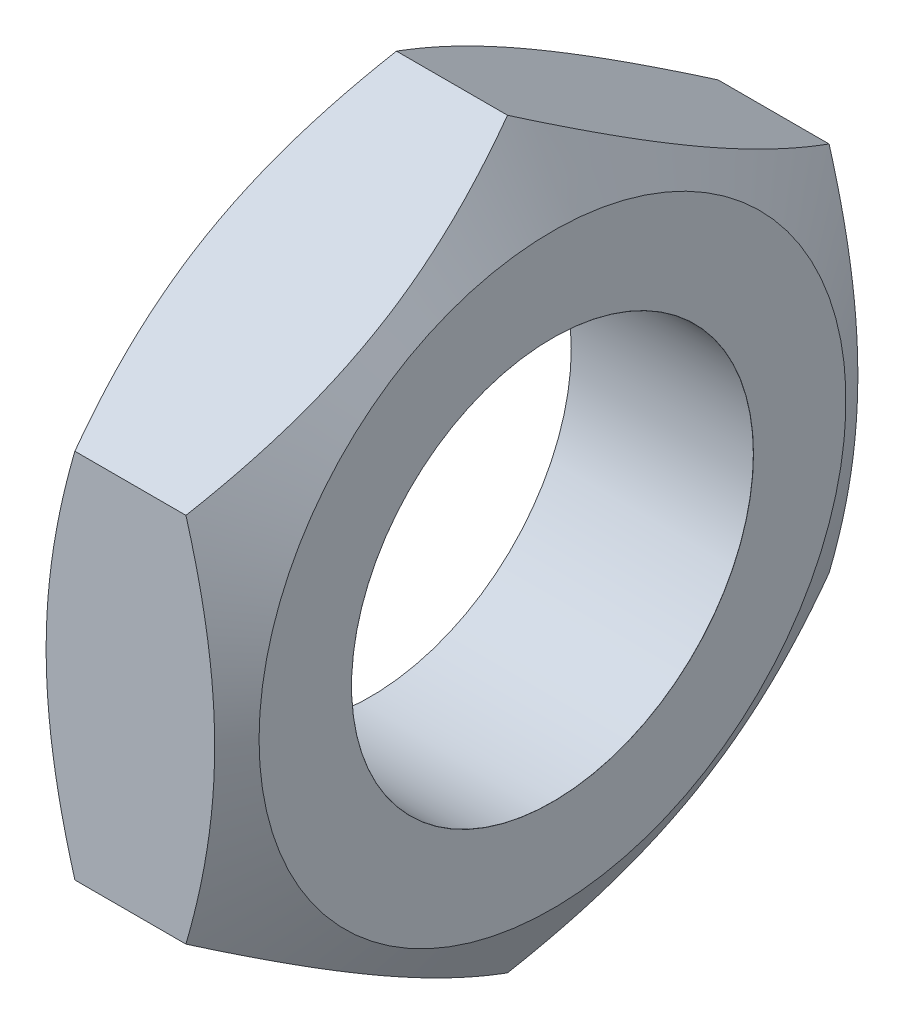
ISO-10303-21;
HEADER;
FILE_DESCRIPTION(('STEP AP214'),'2;1');
FILE_NAME('part.step','',(''),(''),'','','');
FILE_SCHEMA(('AUTOMOTIVE_DESIGN { 1 0 10303 214 1 1 1 1 }'));
ENDSEC;
DATA;
#1=APPLICATION_CONTEXT('core data for automotive mechanical design processes');
#2=APPLICATION_PROTOCOL_DEFINITION('international standard','automotive_design',2000,#1);
#3=PRODUCT_CONTEXT('',#1,'mechanical');
#4=PRODUCT('Part','Part','',(#3));
#5=PRODUCT_RELATED_PRODUCT_CATEGORY('part','',(#4));
#6=PRODUCT_DEFINITION_FORMATION('','',#4);
#7=PRODUCT_DEFINITION_CONTEXT('part definition',#1,'design');
#8=PRODUCT_DEFINITION('design','',#6,#7);
#9=PRODUCT_DEFINITION_SHAPE('','',#8);
#10=(LENGTH_UNIT() NAMED_UNIT(*) SI_UNIT(.MILLI.,.METRE.));
#11=(NAMED_UNIT(*) PLANE_ANGLE_UNIT() SI_UNIT($,.RADIAN.));
#12=(NAMED_UNIT(*) SI_UNIT($,.STERADIAN.) SOLID_ANGLE_UNIT());
#13=UNCERTAINTY_MEASURE_WITH_UNIT(LENGTH_MEASURE(1.E-05),#10,'distance_accuracy_value','');
#14=(GEOMETRIC_REPRESENTATION_CONTEXT(3) GLOBAL_UNCERTAINTY_ASSIGNED_CONTEXT((#13)) GLOBAL_UNIT_ASSIGNED_CONTEXT((#10,
#11,#12)) REPRESENTATION_CONTEXT('',''));
#15=CARTESIAN_POINT('',(0.,0.,0.));
#16=DIRECTION('',(0.,0.,1.));
#17=DIRECTION('',(1.,0.,0.));
#18=AXIS2_PLACEMENT_3D('',#15,#16,#17);
#19=CARTESIAN_POINT('',(0.,-4.61880215351701,8.));
#20=DIRECTION('',(0.,0.,1.));
#21=DIRECTION('',(1.,0.,0.));
#22=AXIS2_PLACEMENT_3D('',#19,#20,#21);
#23=PLANE('',#22);
#24=CARTESIAN_POINT('',(3.88132362213942,4.61880218682748,8.));
#25=CARTESIAN_POINT('',(3.93992799793708,4.41575144561969,8.));
#26=CARTESIAN_POINT('',(3.99587248635568,4.21194366162396,8.));
#27=CARTESIAN_POINT('',(4.10170911059315,3.802672931218,8.));
#28=CARTESIAN_POINT('',(4.15159863394305,3.59720931086582,8.));
#29=CARTESIAN_POINT('',(4.29120532367217,2.97752892750911,8.));
#30=CARTESIAN_POINT('',(4.37061069358878,2.56086607669064,8.));
#31=CARTESIAN_POINT('',(4.46372089588801,1.93733821581197,8.));
#32=CARTESIAN_POINT('',(4.49024491203366,1.73233582319979,8.));
#33=CARTESIAN_POINT('',(4.53472024911559,1.32140406684345,8.));
#34=CARTESIAN_POINT('',(4.55267232746611,1.11547478662251,8.));
#35=CARTESIAN_POINT('',(4.57954882218162,0.703261747832374,8.));
#36=CARTESIAN_POINT('',(4.58848348260018,0.496978658781305,8.));
#37=CARTESIAN_POINT('',(4.59713359947173,0.0842220457071434,8.));
#38=CARTESIAN_POINT('',(4.59684934083956,-0.122251472233446,8.));
#39=CARTESIAN_POINT('',(4.58770360679407,-0.508246386919032,8.));
#40=CARTESIAN_POINT('',(4.57995778465994,-0.687795051906933,8.));
#41=CARTESIAN_POINT('',(4.55764511455832,-1.04647184009549,8.));
#42=CARTESIAN_POINT('',(4.54307780692128,-1.2255999341381,8.));
#43=CARTESIAN_POINT('',(4.48948793186748,-1.76229070219382,8.));
#44=CARTESIAN_POINT('',(4.44058410534341,-2.11890342934541,8.));
#45=CARTESIAN_POINT('',(4.31832622664333,-2.83591118297359,8.));
#46=CARTESIAN_POINT('',(4.24445403359716,-3.1962147220404,8.));
#47=CARTESIAN_POINT('',(4.07679565082677,-3.91144937209577,8.));
#48=CARTESIAN_POINT('',(3.98304882840388,-4.26638963910693,8.));
#49=CARTESIAN_POINT('',(3.88132365675547,-4.61880206691399,8.));
#50=B_SPLINE_CURVE_WITH_KNOTS('',3,(#24,#25,#26,#27,#28,#29,#30,#31,#32,#33,#34,#35,#36,#37,#38,
#39,#40,#41,#42,#43,#44,#45,#46,#47,#48,#49),.UNSPECIFIED.,.F.,.F.,(4,2,2,2,2,2,2,2,2,2,2,2,4),
(0.,0.633965644251984,1.26820385353634,2.5393150776219,3.15930424253739,3.77923861522656,
4.39846792870818,5.01767810464735,5.55669078397927,6.09573979020518,7.17460541916654,
8.27739511741757,9.37802050513486),.UNSPECIFIED.);
#51=CARTESIAN_POINT('',(3.8813236442554,4.61880217516776,7.99999996249979));
#52=VERTEX_POINT('',#51);
#53=CARTESIAN_POINT('',(3.8813236442554,-4.6188021102155,8.));
#54=VERTEX_POINT('',#53);
#55=EDGE_CURVE('E110',#52,#54,#50,.T.);
#56=ORIENTED_EDGE('',*,*,#55,.F.);
#57=DIRECTION('',(1.,0.,0.));
#58=VECTOR('',#57,1.);
#59=CARTESIAN_POINT('',(0.,4.618802153517,7.99999999999999));
#60=LINE('',#59,#58);
#61=CARTESIAN_POINT('',(1.1186763557446,4.6188021102155,8.));
#62=VERTEX_POINT('',#61);
#63=EDGE_CURVE('E97',#62,#52,#60,.T.);
#64=ORIENTED_EDGE('',*,*,#63,.F.);
#65=CARTESIAN_POINT('',(1.11867634324453,-4.61880206691397,8.));
#66=CARTESIAN_POINT('',(1.06007196887349,-4.41575132669639,8.));
#67=CARTESIAN_POINT('',(1.00412748191665,-4.21194354369568,8.));
#68=CARTESIAN_POINT('',(0.898290860667588,-3.80267281530041,8.));
#69=CARTESIAN_POINT('',(0.848401338844366,-3.59720919596393,8.));
#70=CARTESIAN_POINT('',(0.708794653803214,-2.97752881576731,8.));
#71=CARTESIAN_POINT('',(0.629389287131461,-2.56086596714024,8.));
#72=CARTESIAN_POINT('',(0.536279089679928,-1.93733810960556,8.));
#73=CARTESIAN_POINT('',(0.509755075123447,-1.73233571805659,8.));
#74=CARTESIAN_POINT('',(0.465279741203139,-1.32140396388922,8.));
#75=CARTESIAN_POINT('',(0.447327664425094,-1.11547468479404,8.));
#76=CARTESIAN_POINT('',(0.420451172797598,-0.703261648311861,8.));
#77=CARTESIAN_POINT('',(0.411516513895106,-0.496978560442874,8.));
#78=CARTESIAN_POINT('',(0.402866399961908,-0.0842219497998528,8.));
#79=CARTESIAN_POINT('',(0.403150660016351,0.12225156689168,8.));
#80=CARTESIAN_POINT('',(0.412296396535703,0.508246476486118,8.));
#81=CARTESIAN_POINT('',(0.420042219632432,0.68779513764175,8.));
#82=CARTESIAN_POINT('',(0.442354891339297,1.04647191814577,8.));
#83=CARTESIAN_POINT('',(0.456922199618939,1.2256000083361,8.));
#84=CARTESIAN_POINT('',(0.510512076118135,1.76229076480854,8.));
#85=CARTESIAN_POINT('',(0.55941590296145,2.11890348422639,8.));
#86=CARTESIAN_POINT('',(0.681673781109992,2.83591122211498,8.));
#87=CARTESIAN_POINT('',(0.755545973243752,3.19621475318185,8.));
#88=CARTESIAN_POINT('',(0.923204353238337,3.91144938748379,8.));
#89=CARTESIAN_POINT('',(1.01695117380165,4.26638964674061,8.));
#90=CARTESIAN_POINT('',(1.11867634324453,4.61880206691399,8.));
#91=B_SPLINE_CURVE_WITH_KNOTS('',3,(#65,#66,#67,#68,#69,#70,#71,#72,#73,#74,#75,#76,#77,#78,#79,
#80,#81,#82,#83,#84,#85,#86,#87,#88,#89,#90),.UNSPECIFIED.,.F.,.F.,(4,2,2,2,2,2,2,2,2,2,2,2,4),
(0.,0.633965640210397,1.26820384545086,2.53931506123824,3.15930422237858,3.77923859129392,
4.39846790103812,5.01767807323939,5.55669074121955,6.09573973609084,7.17460534227214,
8.27739501650829,9.37802038036412),.UNSPECIFIED.);
#92=CARTESIAN_POINT('',(1.11867637305262,-4.61880214518939,8.00000001442386));
#93=VERTEX_POINT('',#92);
#94=EDGE_CURVE('E144',#93,#62,#91,.T.);
#95=ORIENTED_EDGE('',*,*,#94,.F.);
#96=DIRECTION('',(1.,0.,0.));
#97=VECTOR('',#96,1.);
#98=CARTESIAN_POINT('',(0.,-4.618802153517,8.));
#99=LINE('',#98,#97);
#100=EDGE_CURVE('E113',#54,#93,#99,.F.);
#101=ORIENTED_EDGE('',*,*,#100,.F.);
#102=EDGE_LOOP('',(#56,#64,#95,#101));
#103=FACE_BOUND('',#102,.T.);
#104=ADVANCED_FACE('F40',(#103),#23,.T.);
#105=CARTESIAN_POINT('',(0.,4.618802153517,8.));
#106=DIRECTION('',(0.,0.866025403784438,0.5));
#107=DIRECTION('',(0.,-0.5,0.866025403784438));
#108=AXIS2_PLACEMENT_3D('',#105,#106,#107);
#109=PLANE('',#108);
#110=CARTESIAN_POINT('',(3.88132365675547,9.23760426373249,7.50004314498633E-08));
#111=CARTESIAN_POINT('',(3.93992803112652,9.1360788936237,0.175847174286091));
#112=CARTESIAN_POINT('',(3.99587251808336,9.03417500212334,0.352349891853697));
#113=CARTESIAN_POINT('',(4.10170913933242,8.82953963792571,0.706788739669355));
#114=CARTESIAN_POINT('',(4.15159866115564,8.72680782825747,0.884725453568247));
#115=CARTESIAN_POINT('',(4.29120534619679,8.41696763815916,1.42138440504532));
#116=CARTESIAN_POINT('',(4.37061071286854,8.20863621384562,1.78222501676955));
#117=CARTESIAN_POINT('',(4.46372091032008,7.89687228507828,2.32221598136187));
#118=CARTESIAN_POINT('',(4.49024492487656,7.7943710893038,2.49975326027984));
#119=CARTESIAN_POINT('',(4.53472025879687,7.58890521222011,2.85563059861049));
#120=CARTESIAN_POINT('',(4.55267233557491,7.48594057267253,3.03397058568992));
#121=CARTESIAN_POINT('',(4.57954882720241,7.27983405443143,3.39095754705461));
#122=CARTESIAN_POINT('',(4.5884834861049,7.17669251049694,3.56960394152025));
#123=CARTESIAN_POINT('',(4.5971336000381,6.97031420517543,3.92706165191707));
#124=CARTESIAN_POINT('',(4.59684933998365,6.86707744682966,4.10587296258065));
#125=CARTESIAN_POINT('',(4.5877036034643,6.67407999203244,4.44015436002091));
#126=CARTESIAN_POINT('',(4.57995778036757,6.58430566145463,4.59564806179717));
#127=CARTESIAN_POINT('',(4.55764510866071,6.40496727120262,4.90627126546126));
#128=CARTESIAN_POINT('',(4.54307780038107,6.31540322610745,5.06140074209749));
#129=CARTESIAN_POINT('',(4.48948792388187,6.04705784787124,5.5261885711789));
#130=CARTESIAN_POINT('',(4.44058409703855,5.86875148816231,5.83502424550741));
#131=CARTESIAN_POINT('',(4.31832621889001,5.51024761921801,6.45597116122895));
#132=CARTESIAN_POINT('',(4.24445402675625,5.33009585368458,6.76800317220609));
#133=CARTESIAN_POINT('',(4.07679564676167,4.97247853653361,7.38741453517805));
#134=CARTESIAN_POINT('',(3.98304882619836,4.7950084069052,7.69480181652028));
#135=CARTESIAN_POINT('',(3.88132365675547,4.61880219681851,7.99999992499958));
#136=B_SPLINE_CURVE_WITH_KNOTS('',3,(#110,#111,#112,#113,#114,#115,#116,#117,#118,#119,#120,
#121,#122,#123,#124,#125,#126,#127,#128,#129,#130,#131,#132,#133,#134,#135),.UNSPECIFIED.,.F.,
.F.,(4,2,2,2,2,2,2,2,2,2,2,2,4),(0.,0.633965640210397,1.26820384545086,2.53931506123824,
3.15930422237858,3.77923859129391,4.39846790103811,5.01767807323939,5.55669074121955,
6.09573973609083,7.17460534227213,8.27739501650828,9.37802038036411),.UNSPECIFIED.);
#137=CARTESIAN_POINT('',(3.88132362694738,9.23760431536163,1.44238620701268E-08));
#138=VERTEX_POINT('',#137);
#139=EDGE_CURVE('E100',#138,#52,#136,.T.);
#140=ORIENTED_EDGE('',*,*,#139,.F.);
#141=DIRECTION('',(1.,0.,0.));
#142=VECTOR('',#141,1.);
#143=CARTESIAN_POINT('',(0.,9.23760430703401,0.));
#144=LINE('',#143,#142);
#145=CARTESIAN_POINT('',(1.1186763557446,9.23760428538325,3.75002083037743E-08));
#146=VERTEX_POINT('',#145);
#147=EDGE_CURVE('E90',#146,#138,#144,.T.);
#148=ORIENTED_EDGE('',*,*,#147,.F.);
#149=CARTESIAN_POINT('',(1.11867637786057,4.61880213686177,8.00000002884771));
#150=CARTESIAN_POINT('',(1.06007200206292,4.72032750746566,7.82415292870451));
#151=CARTESIAN_POINT('',(1.00412751364432,4.82223139946353,7.64765021027519));
#152=CARTESIAN_POINT('',(0.898290889406851,5.02686676466651,7.29321136071822));
#153=CARTESIAN_POINT('',(0.848401366056949,5.1295985748426,7.11527464593971));
#154=CARTESIAN_POINT('',(0.708794676327834,5.43943876652095,6.57861569172592));
#155=CARTESIAN_POINT('',(0.629389306411221,5.64777019193018,6.21777507810388));
#156=CARTESIAN_POINT('',(0.53627910411199,5.95953412236952,5.67778411061558));
#157=CARTESIAN_POINT('',(0.509755087966342,6.06203531867561,5.50024683077684));
#158=CARTESIAN_POINT('',(0.465279750884407,6.26750119685378,5.14436949055049));
#159=CARTESIAN_POINT('',(0.447327672533887,6.37046583696425,4.96602950249612));
#160=CARTESIAN_POINT('',(0.420451177818379,6.57657235635932,4.60904253913268));
#161=CARTESIAN_POINT('',(0.411516517399824,6.67971390088485,4.43039614364333));
#162=CARTESIAN_POINT('',(0.402866400528274,6.88609220742193,4.07293843114108));
#163=CARTESIAN_POINT('',(0.403150659160437,6.98932896639223,3.89412711939579));
#164=CARTESIAN_POINT('',(0.41229639320593,7.18232642373502,3.55984571754646));
#165=CARTESIAN_POINT('',(0.420042215340062,7.27210075622897,3.40435201245136));
#166=CARTESIAN_POINT('',(0.442354885441681,7.45143915032325,3.09372880213226));
#167=CARTESIAN_POINT('',(0.456922193078721,7.54100319734456,2.93859932215987));
#168=CARTESIAN_POINT('',(0.510512068132525,7.80934858137241,2.47381148304704));
#169=CARTESIAN_POINT('',(0.559415894656586,7.98765494494821,2.16497580202091));
#170=CARTESIAN_POINT('',(0.68167377335667,8.3461588217623,1.54402887266849));
#171=CARTESIAN_POINT('',(0.755545966402843,8.5263105912957,1.2319968547632));
#172=CARTESIAN_POINT('',(0.923204349173234,8.88392791632339,0.612585478148373));
#173=CARTESIAN_POINT('',(1.01695117159612,9.06139804982897,0.305198190090682));
#174=CARTESIAN_POINT('',(1.11867634324453,9.2376042637325,7.50004162428462E-08));
#175=B_SPLINE_CURVE_WITH_KNOTS('',3,(#149,#150,#151,#152,#153,#154,#155,#156,#157,#158,#159,
#160,#161,#162,#163,#164,#165,#166,#167,#168,#169,#170,#171,#172,#173,#174),.UNSPECIFIED.,.F.,
.F.,(4,2,2,2,2,2,2,2,2,2,2,2,4),(0.,0.633965644251983,1.26820385353634,2.5393150776219,
3.15930424253739,3.77923861522656,4.39846792870818,5.01767810464735,5.55669078397926,
6.09573979020517,7.17460541916653,8.27739511741756,9.37802050513485),.UNSPECIFIED.);
#176=EDGE_CURVE('E101',#62,#146,#175,.T.);
#177=ORIENTED_EDGE('',*,*,#176,.F.);
#178=ORIENTED_EDGE('',*,*,#63,.T.);
#179=EDGE_LOOP('',(#140,#148,#177,#178));
#180=FACE_BOUND('',#179,.T.);
#181=ADVANCED_FACE('F99',(#180),#109,.T.);
#182=CARTESIAN_POINT('',(0.,9.23760430703401,0.));
#183=DIRECTION('',(0.,0.866025403784439,-0.499999999999999));
#184=DIRECTION('',(0.,0.499999999999999,0.866025403784439));
#185=AXIS2_PLACEMENT_3D('',#182,#183,#184);
#186=PLANE('',#185);
#187=CARTESIAN_POINT('',(3.88132362213942,4.61880213686178,-8.00000002884771));
#188=CARTESIAN_POINT('',(3.93992799794268,4.72032750747539,-7.82415292868769));
#189=CARTESIAN_POINT('',(3.99587248636637,4.82223139948304,-7.64765021024143));
#190=CARTESIAN_POINT('',(4.10170911061281,5.02686676470575,-7.29321136065027));
#191=CARTESIAN_POINT('',(4.15159863396659,5.12959857489179,-7.11527464585453));
#192=CARTESIAN_POINT('',(4.29120532370625,5.43943876660274,-6.57861569158428));
#193=CARTESIAN_POINT('',(4.370610693627,5.6477701920349,-6.21777507792253));
#194=CARTESIAN_POINT('',(4.4637208959198,5.95953412248738,-5.67778411041147));
#195=CARTESIAN_POINT('',(4.49024491205974,6.06203531878344,-5.5002468305901));
#196=CARTESIAN_POINT('',(4.53472024913182,6.26750119694143,-5.1443694903987));
#197=CARTESIAN_POINT('',(4.55267232747819,6.37046583704174,-4.96602950236192));
#198=CARTESIAN_POINT('',(4.57954882218694,6.57657235641527,-4.60904253903579));
#199=CARTESIAN_POINT('',(4.58848348260298,6.67971390092941,-4.43039614356616));
#200=CARTESIAN_POINT('',(4.5971335994717,6.88609220744393,-4.072938431103));
#201=CARTESIAN_POINT('',(4.59684934083918,6.98932896640305,-3.89412711937706));
#202=CARTESIAN_POINT('',(4.58770360667397,7.18232642626683,-3.55984571316125));
#203=CARTESIAN_POINT('',(4.57995778422284,7.27210076129045,-3.40435200368464));
#204=CARTESIAN_POINT('',(4.55764511310816,7.45143916042885,-3.09372878462885));
#205=CARTESIAN_POINT('',(4.54307780477499,7.54100320996462,-2.93859930030129));
#206=CARTESIAN_POINT('',(4.48948792709851,7.80934860151534,-2.47381144815848));
#207=CARTESIAN_POINT('',(4.44058409811447,7.98765497006367,-2.16497575851966));
#208=CARTESIAN_POINT('',(4.3183262132789,8.34615885693608,-1.54402881174572));
#209=CARTESIAN_POINT('',(4.24445401651273,8.52631063155027,-1.23199678504024));
#210=CARTESIAN_POINT('',(4.07679562549338,8.88392796655467,-0.612585391145249));
#211=CARTESIAN_POINT('',(3.98304879854644,9.06139810495683,-0.305198094606421));
#212=CARTESIAN_POINT('',(3.88132362213943,9.23760432368925,2.88477234343365E-08));
#213=B_SPLINE_CURVE_WITH_KNOTS('',3,(#187,#188,#189,#190,#191,#192,#193,#194,#195,#196,#197,
#198,#199,#200,#201,#202,#203,#204,#205,#206,#207,#208,#209,#210,#211,#212),.UNSPECIFIED.,.F.,
.F.,(4,2,2,2,2,2,2,2,2,2,2,2,4),(0.,0.63396564431261,1.26820385365771,2.53931507788017,
3.15930424273385,3.77923861536134,4.3984679287742,5.01767810464729,5.55669079917204,
6.09573982059532,7.17460548004319,8.27739521036386,9.37802062990663),.UNSPECIFIED.);
#214=CARTESIAN_POINT('',(3.88132364425539,4.61880211021551,-8.));
#215=VERTEX_POINT('',#214);
#216=EDGE_CURVE('E112',#215,#138,#213,.T.);
#217=ORIENTED_EDGE('',*,*,#216,.F.);
#218=DIRECTION('',(1.,0.,0.));
#219=VECTOR('',#218,1.);
#220=CARTESIAN_POINT('',(0.,4.61880215351703,-8.));
#221=LINE('',#220,#219);
#222=CARTESIAN_POINT('',(1.11867635574461,4.61880217516778,-7.99999996249979));
#223=VERTEX_POINT('',#222);
#224=EDGE_CURVE('E217',#223,#215,#221,.T.);
#225=ORIENTED_EDGE('',*,*,#224,.F.);
#226=CARTESIAN_POINT('',(1.11867637786058,9.23760432368925,2.88477179782626E-08));
#227=CARTESIAN_POINT('',(1.06007200206292,9.13607895308535,-0.175847071295485));
#228=CARTESIAN_POINT('',(1.00412751364432,9.03417506108749,-0.352349789724802));
#229=CARTESIAN_POINT('',(0.898290889406854,8.82953969588451,-0.706788639281778));
#230=CARTESIAN_POINT('',(0.848401366056952,8.72680788570842,-0.884725354060287));
#231=CARTESIAN_POINT('',(0.708794676327837,8.41696769403006,-1.42138430827408));
#232=CARTESIAN_POINT('',(0.629389306411225,8.20863626862083,-1.78222492189611));
#233=CARTESIAN_POINT('',(0.536279104111994,7.89687233818149,-2.32221588938442));
#234=CARTESIAN_POINT('',(0.509755087966346,7.79437114187541,-2.49975316922315));
#235=CARTESIAN_POINT('',(0.465279750884411,7.58890526369723,-2.8556305094495));
#236=CARTESIAN_POINT('',(0.447327672533891,7.48594062358677,-3.03397049750388));
#237=CARTESIAN_POINT('',(0.420451177818383,7.2798341041917,-3.39095746086732));
#238=CARTESIAN_POINT('',(0.411516517399827,7.17669255966616,-3.56960385635667));
#239=CARTESIAN_POINT('',(0.402866400528278,6.97031425312908,-3.92706156885892));
#240=CARTESIAN_POINT('',(0.403150659160441,6.86707749415879,-4.10587288060421));
#241=CARTESIAN_POINT('',(0.412296393205935,6.674080036816,-4.44015428245354));
#242=CARTESIAN_POINT('',(0.420042215340068,6.58430570432205,-4.59564798754864));
#243=CARTESIAN_POINT('',(0.442354885441686,6.40496731022777,-4.90627119786774));
#244=CARTESIAN_POINT('',(0.456922193078726,6.31540326320647,-5.06140067784013));
#245=CARTESIAN_POINT('',(0.510512068132528,6.04705787917861,-5.52618851695296));
#246=CARTESIAN_POINT('',(0.559415894656589,5.86875151560282,-5.83502419797908));
#247=CARTESIAN_POINT('',(0.681673773356673,5.51024763878873,-6.4559711273315));
#248=CARTESIAN_POINT('',(0.755545966402847,5.33009586925533,-6.76800314523679));
#249=CARTESIAN_POINT('',(0.923204349173236,4.97247854422764,-7.38741452185162));
#250=CARTESIAN_POINT('',(1.01695117159612,4.79500841072207,-7.69480180990931));
#251=CARTESIAN_POINT('',(1.11867634324453,4.61880219681854,-7.99999992499957));
#252=B_SPLINE_CURVE_WITH_KNOTS('',3,(#226,#227,#228,#229,#230,#231,#232,#233,#234,#235,#236,
#237,#238,#239,#240,#241,#242,#243,#244,#245,#246,#247,#248,#249,#250,#251),.UNSPECIFIED.,.F.,
.F.,(4,2,2,2,2,2,2,2,2,2,2,2,4),(0.,0.633965644251983,1.26820385353634,2.5393150776219,
3.15930424253739,3.77923861522656,4.39846792870818,5.01767810464735,5.55669078397926,
6.09573979020517,7.17460541916653,8.27739511741755,9.37802050513484),.UNSPECIFIED.);
#253=EDGE_CURVE('E187',#146,#223,#252,.T.);
#254=ORIENTED_EDGE('',*,*,#253,.F.);
#255=ORIENTED_EDGE('',*,*,#147,.T.);
#256=EDGE_LOOP('',(#217,#225,#254,#255));
#257=FACE_BOUND('',#256,.T.);
#258=ADVANCED_FACE('F191',(#257),#186,.T.);
#259=CARTESIAN_POINT('',(0.,4.61880215351702,-8.));
#260=DIRECTION('',(0.,0.,-1.));
#261=DIRECTION('',(0.,1.,0.));
#262=AXIS2_PLACEMENT_3D('',#259,#260,#261);
#263=PLANE('',#262);
#264=CARTESIAN_POINT('',(3.88132362213942,-4.61880218682745,-8.00000000000002));
#265=CARTESIAN_POINT('',(3.93992799793708,-4.41575144561966,-8.00000000000002));
#266=CARTESIAN_POINT('',(3.99587248635567,-4.21194366162393,-8.00000000000002));
#267=CARTESIAN_POINT('',(4.10170911059314,-3.80267293121797,-8.00000000000002));
#268=CARTESIAN_POINT('',(4.15159863394305,-3.59720931086579,-8.00000000000002));
#269=CARTESIAN_POINT('',(4.29120532367216,-2.97752892750908,-8.00000000000002));
#270=CARTESIAN_POINT('',(4.37061069358877,-2.56086607669061,-8.00000000000002));
#271=CARTESIAN_POINT('',(4.463720895888,-1.93733821581194,-8.00000000000002));
#272=CARTESIAN_POINT('',(4.49024491203365,-1.73233582319976,-8.00000000000001));
#273=CARTESIAN_POINT('',(4.53472024911559,-1.32140406684342,-8.00000000000001));
#274=CARTESIAN_POINT('',(4.55267232746611,-1.11547478662248,-8.00000000000001));
#275=CARTESIAN_POINT('',(4.57954882218162,-0.703261747832344,-8.00000000000001));
#276=CARTESIAN_POINT('',(4.58848348260017,-0.496978658781275,-8.00000000000001));
#277=CARTESIAN_POINT('',(4.59713359947172,-0.0842220457071137,-8.00000000000001));
#278=CARTESIAN_POINT('',(4.59684934083956,0.122251472233476,-8.00000000000001));
#279=CARTESIAN_POINT('',(4.58770360679406,0.50824638691906,-8.00000000000001));
#280=CARTESIAN_POINT('',(4.57995778465993,0.68779505190696,-8.00000000000001));
#281=CARTESIAN_POINT('',(4.55764511455831,1.04647184009552,-8.00000000000001));
#282=CARTESIAN_POINT('',(4.54307780692127,1.22559993413813,-8.00000000000001));
#283=CARTESIAN_POINT('',(4.48948793186747,1.76229070219384,-8.00000000000001));
#284=CARTESIAN_POINT('',(4.44058410534341,2.11890342934543,-8.00000000000001));
#285=CARTESIAN_POINT('',(4.31832622664333,2.83591118297361,-8.00000000000001));
#286=CARTESIAN_POINT('',(4.24445403359715,3.19621472204041,-8.));
#287=CARTESIAN_POINT('',(4.07679565082676,3.91144937209578,-8.));
#288=CARTESIAN_POINT('',(3.98304882840388,4.26638963910693,-8.));
#289=CARTESIAN_POINT('',(3.88132365675547,4.61880206691399,-8.));
#290=B_SPLINE_CURVE_WITH_KNOTS('',3,(#264,#265,#266,#267,#268,#269,#270,#271,#272,#273,#274,
#275,#276,#277,#278,#279,#280,#281,#282,#283,#284,#285,#286,#287,#288,#289),.UNSPECIFIED.,.F.,
.F.,(4,2,2,2,2,2,2,2,2,2,2,2,4),(0.,0.633965644251984,1.26820385353634,2.5393150776219,
3.15930424253739,3.77923861522656,4.39846792870818,5.01767810464735,5.55669078397926,
6.09573979020518,7.17460541916653,8.27739511741755,9.37802050513484),.UNSPECIFIED.);
#291=CARTESIAN_POINT('',(3.88132364425539,-4.61880217516774,-7.99999996249982));
#292=VERTEX_POINT('',#291);
#293=EDGE_CURVE('E202',#292,#215,#290,.T.);
#294=ORIENTED_EDGE('',*,*,#293,.F.);
#295=DIRECTION('',(1.,0.,0.));
#296=VECTOR('',#295,1.);
#297=CARTESIAN_POINT('',(0.,-4.61880215351698,-8.00000000000003));
#298=LINE('',#297,#296);
#299=CARTESIAN_POINT('',(1.11867635574461,-4.61880211021547,-8.00000000000002));
#300=VERTEX_POINT('',#299);
#301=EDGE_CURVE('E215',#300,#292,#298,.T.);
#302=ORIENTED_EDGE('',*,*,#301,.F.);
#303=CARTESIAN_POINT('',(1.11867637786058,4.6188021868275,-8.));
#304=CARTESIAN_POINT('',(1.06007200206293,4.41575144561971,-8.));
#305=CARTESIAN_POINT('',(1.00412751364433,4.21194366162398,-8.));
#306=CARTESIAN_POINT('',(0.898290889406861,3.80267293121802,-8.));
#307=CARTESIAN_POINT('',(0.848401366056959,3.59720931086584,-8.));
#308=CARTESIAN_POINT('',(0.708794676327844,2.97752892750913,-8.));
#309=CARTESIAN_POINT('',(0.629389306411231,2.56086607669066,-8.));
#310=CARTESIAN_POINT('',(0.536279104111999,1.93733821581199,-8.00000000000001));
#311=CARTESIAN_POINT('',(0.509755087966351,1.73233582319981,-8.00000000000001));
#312=CARTESIAN_POINT('',(0.465279750884416,1.32140406684347,-8.00000000000001));
#313=CARTESIAN_POINT('',(0.447327672533895,1.11547478662253,-8.00000000000001));
#314=CARTESIAN_POINT('',(0.420451177818387,0.703261747832391,-8.00000000000001));
#315=CARTESIAN_POINT('',(0.411516517399832,0.496978658781322,-8.00000000000001));
#316=CARTESIAN_POINT('',(0.402866400528282,0.0842220457071595,-8.00000000000001));
#317=CARTESIAN_POINT('',(0.403150659160445,-0.12225147223343,-8.00000000000001));
#318=CARTESIAN_POINT('',(0.412296393205938,-0.508246386919015,-8.00000000000001));
#319=CARTESIAN_POINT('',(0.420042215340071,-0.687795051906915,-8.00000000000001));
#320=CARTESIAN_POINT('',(0.442354885441689,-1.04647184009547,-8.00000000000001));
#321=CARTESIAN_POINT('',(0.456922193078729,-1.22559993413808,-8.00000000000001));
#322=CARTESIAN_POINT('',(0.510512068132532,-1.7622907021938,-8.00000000000002));
#323=CARTESIAN_POINT('',(0.559415894656593,-2.11890342934539,-8.00000000000002));
#324=CARTESIAN_POINT('',(0.681673773356676,-2.83591118297357,-8.00000000000002));
#325=CARTESIAN_POINT('',(0.75554596640285,-3.19621472204037,-8.00000000000002));
#326=CARTESIAN_POINT('',(0.923204349173239,-3.91144937209574,-8.00000000000002));
#327=CARTESIAN_POINT('',(1.01695117159613,-4.26638963910689,-8.00000000000002));
#328=CARTESIAN_POINT('',(1.11867634324454,-4.61880206691396,-8.00000000000002));
#329=B_SPLINE_CURVE_WITH_KNOTS('',3,(#303,#304,#305,#306,#307,#308,#309,#310,#311,#312,#313,
#314,#315,#316,#317,#318,#319,#320,#321,#322,#323,#324,#325,#326,#327,#328),.UNSPECIFIED.,.F.,
.F.,(4,2,2,2,2,2,2,2,2,2,2,2,4),(0.,0.633965644251983,1.26820385353635,2.5393150776219,
3.15930424253739,3.77923861522657,4.39846792870819,5.01767810464736,5.55669078397927,
6.09573979020518,7.17460541916654,8.27739511741756,9.37802050513485),.UNSPECIFIED.);
#330=EDGE_CURVE('E182',#223,#300,#329,.T.);
#331=ORIENTED_EDGE('',*,*,#330,.F.);
#332=ORIENTED_EDGE('',*,*,#224,.T.);
#333=EDGE_LOOP('',(#294,#302,#331,#332));
#334=FACE_BOUND('',#333,.T.);
#335=ADVANCED_FACE('F194',(#334),#263,.T.);
#336=CARTESIAN_POINT('',(0.,-4.61880215351699,-8.00000000000002));
#337=DIRECTION('',(0.,-0.866025403784438,-0.500000000000001));
#338=DIRECTION('',(0.,0.500000000000001,-0.866025403784438));
#339=AXIS2_PLACEMENT_3D('',#336,#337,#338);
#340=PLANE('',#339);
#341=CARTESIAN_POINT('',(3.88132362213942,-9.23760432368925,2.88477122279754E-08));
#342=CARTESIAN_POINT('',(3.93992799793708,-9.13607895308536,-0.175847071295491));
#343=CARTESIAN_POINT('',(3.99587248635567,-9.0341750610875,-0.352349789724808));
#344=CARTESIAN_POINT('',(4.10170911059314,-8.82953969588451,-0.706788639281784));
#345=CARTESIAN_POINT('',(4.15159863394305,-8.72680788570842,-0.884725354060292));
#346=CARTESIAN_POINT('',(4.29120532367216,-8.41696769403007,-1.42138430827408));
#347=CARTESIAN_POINT('',(4.37061069358878,-8.20863626862083,-1.78222492189612));
#348=CARTESIAN_POINT('',(4.46372089588801,-7.89687233818149,-2.32221588938442));
#349=CARTESIAN_POINT('',(4.49024491203366,-7.79437114187541,-2.49975316922316));
#350=CARTESIAN_POINT('',(4.53472024911559,-7.58890526369723,-2.85563050944951));
#351=CARTESIAN_POINT('',(4.55267232746611,-7.48594062358677,-3.03397049750388));
#352=CARTESIAN_POINT('',(4.57954882218162,-7.2798341041917,-3.39095746086732));
#353=CARTESIAN_POINT('',(4.58848348260018,-7.17669255966616,-3.56960385635667));
#354=CARTESIAN_POINT('',(4.59713359947173,-6.97031425312908,-3.92706156885892));
#355=CARTESIAN_POINT('',(4.59684934083956,-6.86707749415879,-4.10587288060421));
#356=CARTESIAN_POINT('',(4.58770360679407,-6.67408003681599,-4.44015428245354));
#357=CARTESIAN_POINT('',(4.57995778465994,-6.58430570432204,-4.59564798754864));
#358=CARTESIAN_POINT('',(4.55764511455832,-6.40496731022776,-4.90627119786775));
#359=CARTESIAN_POINT('',(4.54307780692128,-6.31540326320645,-5.06140067784014));
#360=CARTESIAN_POINT('',(4.48948793186748,-6.04705787917859,-5.52618851695297));
#361=CARTESIAN_POINT('',(4.44058410534341,-5.8687515156028,-5.8350241979791));
#362=CARTESIAN_POINT('',(4.31832622664333,-5.5102476387887,-6.45597112733152));
#363=CARTESIAN_POINT('',(4.24445403359715,-5.3300958692553,-6.76800314523682));
#364=CARTESIAN_POINT('',(4.07679565082676,-4.97247854422761,-7.38741452185165));
#365=CARTESIAN_POINT('',(3.98304882840387,-4.79500841072203,-7.69480180990934));
#366=CARTESIAN_POINT('',(3.88132365675546,-4.6188021968185,-7.99999992499961));
#367=B_SPLINE_CURVE_WITH_KNOTS('',3,(#341,#342,#343,#344,#345,#346,#347,#348,#349,#350,#351,
#352,#353,#354,#355,#356,#357,#358,#359,#360,#361,#362,#363,#364,#365,#366),.UNSPECIFIED.,.F.,
.F.,(4,2,2,2,2,2,2,2,2,2,2,2,4),(0.,0.633965644251984,1.26820385353634,2.5393150776219,
3.15930424253739,3.77923861522656,4.39846792870818,5.01767810464735,5.55669078397927,
6.09573979020519,7.17460541916656,8.27739511741759,9.37802050513489),.UNSPECIFIED.);
#368=CARTESIAN_POINT('',(3.8813236442554,-9.23760428538325,3.75002096688167E-08));
#369=VERTEX_POINT('',#368);
#370=EDGE_CURVE('E118',#369,#292,#367,.T.);
#371=ORIENTED_EDGE('',*,*,#370,.F.);
#372=DIRECTION('',(1.,0.,0.));
#373=VECTOR('',#372,1.);
#374=CARTESIAN_POINT('',(0.,-9.23760430703401,0.));
#375=LINE('',#374,#373);
#376=CARTESIAN_POINT('',(1.1186763557446,-9.23760428538325,-3.75002148002822E-08));
#377=VERTEX_POINT('',#376);
#378=EDGE_CURVE('E219',#377,#369,#375,.T.);
#379=ORIENTED_EDGE('',*,*,#378,.F.);
#380=CARTESIAN_POINT('',(1.11867637786058,-4.61880213686175,-8.00000002884774));
#381=CARTESIAN_POINT('',(1.06007200206293,-4.72032750746564,-7.82415292870454));
#382=CARTESIAN_POINT('',(1.00412751364433,-4.82223139946351,-7.64765021027522));
#383=CARTESIAN_POINT('',(0.898290889406861,-5.02686676466649,-7.29321136071824));
#384=CARTESIAN_POINT('',(0.848401366056957,-5.12959857484258,-7.11527464593973));
#385=CARTESIAN_POINT('',(0.708794676327841,-5.43943876652094,-6.57861569172595));
#386=CARTESIAN_POINT('',(0.629389306411229,-5.64777019193017,-6.21777507810391));
#387=CARTESIAN_POINT('',(0.536279104111996,-5.95953412236951,-5.6777841106156));
#388=CARTESIAN_POINT('',(0.509755087966347,-6.0620353186756,-5.50024683077687));
#389=CARTESIAN_POINT('',(0.465279750884412,-6.26750119685377,-5.14436949055052));
#390=CARTESIAN_POINT('',(0.447327672533892,-6.37046583696424,-4.96602950249614));
#391=CARTESIAN_POINT('',(0.420451177818384,-6.57657235635931,-4.6090425391327));
#392=CARTESIAN_POINT('',(0.411516517399827,-6.67971390088484,-4.43039614364335));
#393=CARTESIAN_POINT('',(0.402866400528277,-6.88609220742193,-4.0729384311411));
#394=CARTESIAN_POINT('',(0.40315065916044,-6.98932896639222,-3.89412711939581));
#395=CARTESIAN_POINT('',(0.412296393205933,-7.18232642373501,-3.55984571754649));
#396=CARTESIAN_POINT('',(0.420042215340065,-7.27210075622896,-3.40435201245138));
#397=CARTESIAN_POINT('',(0.442354885441683,-7.45143915032325,-3.09372880213228));
#398=CARTESIAN_POINT('',(0.456922193078723,-7.54100319734455,-2.93859932215989));
#399=CARTESIAN_POINT('',(0.510512068132527,-7.80934858137241,-2.47381148304706));
#400=CARTESIAN_POINT('',(0.559415894656587,-7.98765494494821,-2.16497580202093));
#401=CARTESIAN_POINT('',(0.68167377335667,-8.3461588217623,-1.54402887266851));
#402=CARTESIAN_POINT('',(0.755545966402844,-8.5263105912957,-1.23199685476322));
#403=CARTESIAN_POINT('',(0.923204349173235,-8.88392791632339,-0.612585478148389));
#404=CARTESIAN_POINT('',(1.01695117159612,-9.06139804982897,-0.305198190090699));
#405=CARTESIAN_POINT('',(1.11867634324453,-9.2376042637325,-7.50004329944215E-08));
#406=B_SPLINE_CURVE_WITH_KNOTS('',3,(#380,#381,#382,#383,#384,#385,#386,#387,#388,#389,#390,
#391,#392,#393,#394,#395,#396,#397,#398,#399,#400,#401,#402,#403,#404,#405),.UNSPECIFIED.,.F.,
.F.,(4,2,2,2,2,2,2,2,2,2,2,2,4),(0.,0.633965644251985,1.26820385353635,2.5393150776219,
3.15930424253739,3.77923861522657,4.39846792870819,5.01767810464736,5.55669078397927,
6.09573979020519,7.17460541916655,8.27739511741758,9.37802050513487),.UNSPECIFIED.);
#407=EDGE_CURVE('E57',#300,#377,#406,.T.);
#408=ORIENTED_EDGE('',*,*,#407,.F.);
#409=ORIENTED_EDGE('',*,*,#301,.T.);
#410=EDGE_LOOP('',(#371,#379,#408,#409));
#411=FACE_BOUND('',#410,.T.);
#412=ADVANCED_FACE('F198',(#411),#340,.T.);
#413=CARTESIAN_POINT('',(0.,-9.23760430703401,0.));
#414=DIRECTION('',(0.,-0.866025403784439,0.5));
#415=DIRECTION('',(0.,-0.5,-0.866025403784439));
#416=AXIS2_PLACEMENT_3D('',#413,#414,#415);
#417=PLANE('',#416);
#418=CARTESIAN_POINT('',(3.88132362213943,-4.61880213686177,8.00000002884771));
#419=CARTESIAN_POINT('',(3.93992799793708,-4.72032750746567,7.82415292870451));
#420=CARTESIAN_POINT('',(3.99587248635568,-4.82223139946353,7.64765021027519));
#421=CARTESIAN_POINT('',(4.10170911059315,-5.02686676466651,7.29321136071822));
#422=CARTESIAN_POINT('',(4.15159863394305,-5.1295985748426,7.11527464593971));
#423=CARTESIAN_POINT('',(4.29120532367217,-5.43943876652096,6.57861569172592));
#424=CARTESIAN_POINT('',(4.37061069358878,-5.64777019193019,6.21777507810388));
#425=CARTESIAN_POINT('',(4.46372089588801,-5.95953412236953,5.67778411061558));
#426=CARTESIAN_POINT('',(4.49024491203366,-6.06203531867561,5.50024683077684));
#427=CARTESIAN_POINT('',(4.53472024911559,-6.26750119685379,5.14436949055049));
#428=CARTESIAN_POINT('',(4.55267232746611,-6.37046583696426,4.96602950249612));
#429=CARTESIAN_POINT('',(4.57954882218162,-6.57657235635932,4.60904253913268));
#430=CARTESIAN_POINT('',(4.58848348260018,-6.67971390088486,4.43039614364332));
#431=CARTESIAN_POINT('',(4.59713359947173,-6.88609220742194,4.07293843114108));
#432=CARTESIAN_POINT('',(4.59684934083956,-6.98932896639223,3.89412711939578));
#433=CARTESIAN_POINT('',(4.58770360679407,-7.18232642373502,3.55984571754646));
#434=CARTESIAN_POINT('',(4.57995778465994,-7.27210075622898,3.40435201245136));
#435=CARTESIAN_POINT('',(4.55764511455832,-7.45143915032325,3.09372880213225));
#436=CARTESIAN_POINT('',(4.54307780692128,-7.54100319734456,2.93859932215987));
#437=CARTESIAN_POINT('',(4.48948793186748,-7.80934858137242,2.47381148304704));
#438=CARTESIAN_POINT('',(4.44058410534342,-7.98765494494821,2.16497580202091));
#439=CARTESIAN_POINT('',(4.31832622664333,-8.3461588217623,1.54402887266849));
#440=CARTESIAN_POINT('',(4.24445403359716,-8.52631059129571,1.2319968547632));
#441=CARTESIAN_POINT('',(4.07679565082677,-8.88392791632339,0.612585478148371));
#442=CARTESIAN_POINT('',(3.98304882840388,-9.06139804982897,0.305198190090682));
#443=CARTESIAN_POINT('',(3.88132365675547,-9.2376042637325,7.50004168276655E-08));
#444=B_SPLINE_CURVE_WITH_KNOTS('',3,(#418,#419,#420,#421,#422,#423,#424,#425,#426,#427,#428,
#429,#430,#431,#432,#433,#434,#435,#436,#437,#438,#439,#440,#441,#442,#443),.UNSPECIFIED.,.F.,
.F.,(4,2,2,2,2,2,2,2,2,2,2,2,4),(0.,0.633965644251983,1.26820385353634,2.5393150776219,
3.15930424253739,3.77923861522656,4.39846792870818,5.01767810464735,5.55669078397926,
6.09573979020518,7.17460541916654,8.27739511741756,9.37802050513485),.UNSPECIFIED.);
#445=EDGE_CURVE('E116',#54,#369,#444,.T.);
#446=ORIENTED_EDGE('',*,*,#445,.F.);
#447=ORIENTED_EDGE('',*,*,#100,.T.);
#448=CARTESIAN_POINT('',(1.11867637786058,-9.23760432368925,-2.88477199595016E-08));
#449=CARTESIAN_POINT('',(1.06007200205732,-9.13607895307564,0.175847071312303));
#450=CARTESIAN_POINT('',(1.00412751363363,-9.03417506106799,0.352349789758564));
#451=CARTESIAN_POINT('',(0.898290889387186,-8.82953969584528,0.706788639349718));
#452=CARTESIAN_POINT('',(0.848401366033413,-8.72680788565924,0.884725354145461));
#453=CARTESIAN_POINT('',(0.708794676293751,-8.41696769394829,1.42138430841571));
#454=CARTESIAN_POINT('',(0.629389306372995,-8.20863626851613,1.78222492207746));
#455=CARTESIAN_POINT('',(0.536279104080201,-7.89687233806365,2.32221588958852));
#456=CARTESIAN_POINT('',(0.509755087940261,-7.79437114176759,2.49975316940989));
#457=CARTESIAN_POINT('',(0.465279750868181,-7.5889052636096,2.85563050960129));
#458=CARTESIAN_POINT('',(0.447327672521809,-7.48594062350929,3.03397049763807));
#459=CARTESIAN_POINT('',(0.420451177813062,-7.27983410413576,3.39095746096419));
#460=CARTESIAN_POINT('',(0.411516517397017,-7.17669255962162,3.56960385643383));
#461=CARTESIAN_POINT('',(0.402866400528295,-6.9703142531071,3.92706156889699));
#462=CARTESIAN_POINT('',(0.403150659160815,-6.86707749414798,4.10587288062292));
#463=CARTESIAN_POINT('',(0.412296393326025,-6.6740800342842,4.44015428683873));
#464=CARTESIAN_POINT('',(0.42004221577716,-6.58430569926058,4.59564799631535));
#465=CARTESIAN_POINT('',(0.44235488689184,-6.40496730012217,4.90627121537114));
#466=CARTESIAN_POINT('',(0.45692219522501,-6.31540325058641,5.0614006996987));
#467=CARTESIAN_POINT('',(0.510512072901487,-6.04705785903569,5.52618855184151));
#468=CARTESIAN_POINT('',(0.559415901885529,-5.86875149048735,5.83502424148033));
#469=CARTESIAN_POINT('',(0.681673786721104,-5.51024760361494,6.45597118825427));
#470=CARTESIAN_POINT('',(0.755545983487266,-5.33009582900075,6.76800321495975));
#471=CARTESIAN_POINT('',(0.92320437450662,-4.97247849399635,7.38741460885474));
#472=CARTESIAN_POINT('',(1.01695120145356,-4.79500835559419,7.69480190539357));
#473=CARTESIAN_POINT('',(1.11867637786058,-4.61880213686177,8.00000002884772));
#474=B_SPLINE_CURVE_WITH_KNOTS('',3,(#448,#449,#450,#451,#452,#453,#454,#455,#456,#457,#458,
#459,#460,#461,#462,#463,#464,#465,#466,#467,#468,#469,#470,#471,#472,#473),.UNSPECIFIED.,.F.,
.F.,(4,2,2,2,2,2,2,2,2,2,2,2,4),(0.,0.63396564431261,1.26820385365771,2.53931507788017,
3.15930424273385,3.77923861536133,4.3984679287742,5.01767810464729,5.55669079917204,
6.09573982059532,7.17460548004319,8.27739521036387,9.37802062990664),.UNSPECIFIED.);
#475=EDGE_CURVE('E170',#377,#93,#474,.T.);
#476=ORIENTED_EDGE('',*,*,#475,.F.);
#477=ORIENTED_EDGE('',*,*,#378,.T.);
#478=EDGE_LOOP('',(#446,#447,#476,#477));
#479=FACE_BOUND('',#478,.T.);
#480=ADVANCED_FACE('F236',(#479),#417,.T.);
#481=CARTESIAN_POINT('',(3.87461157354478,0.,0.));
#482=DIRECTION('',(-1.,0.,0.));
#483=DIRECTION('',(0.,0.,1.));
#484=AXIS2_PLACEMENT_3D('',#481,#482,#483);
#485=CONICAL_SURFACE('',#484,9.24922993287814,1.0471975512);
#486=CARTESIAN_POINT('',(4.9999999999967,0.,0.));
#487=DIRECTION('',(-1.,0.,0.));
#488=DIRECTION('',(0.,0.,1.));
#489=AXIS2_PLACEMENT_3D('',#486,#487,#488);
#490=CIRCLE('',#489,7.2999999999981);
#491=CARTESIAN_POINT('',(4.9999999999967,0.,7.2999999999981));
#492=VERTEX_POINT('',#491);
#493=EDGE_CURVE('E230',#492,#492,#490,.F.);
#494=ORIENTED_EDGE('',*,*,#493,.F.);
#495=EDGE_LOOP('',(#494));
#496=FACE_BOUND('',#495,.T.);
#497=ORIENTED_EDGE('',*,*,#293,.T.);
#498=ORIENTED_EDGE('',*,*,#216,.T.);
#499=ORIENTED_EDGE('',*,*,#139,.T.);
#500=ORIENTED_EDGE('',*,*,#55,.T.);
#501=ORIENTED_EDGE('',*,*,#445,.T.);
#502=ORIENTED_EDGE('',*,*,#370,.T.);
#503=EDGE_LOOP('',(#497,#498,#499,#500,#501,#502));
#504=FACE_BOUND('',#503,.T.);
#505=ADVANCED_FACE('F108',(#496,#504),#485,.T.);
#506=CARTESIAN_POINT('',(1.12538842645523,0.,0.));
#507=DIRECTION('',(1.,0.,0.));
#508=DIRECTION('',(0.,0.,-1.));
#509=AXIS2_PLACEMENT_3D('',#506,#507,#508);
#510=CONICAL_SURFACE('',#509,9.24922993287814,1.0471975512);
#511=CARTESIAN_POINT('',(3.29770932783191E-12,0.,0.));
#512=DIRECTION('',(1.,0.,0.));
#513=DIRECTION('',(0.,0.,-1.));
#514=AXIS2_PLACEMENT_3D('',#511,#512,#513);
#515=CIRCLE('',#514,7.2999999999981);
#516=CARTESIAN_POINT('',(3.29770932783191E-12,0.,-7.2999999999981));
#517=VERTEX_POINT('',#516);
#518=EDGE_CURVE('E228',#517,#517,#515,.T.);
#519=ORIENTED_EDGE('',*,*,#518,.T.);
#520=EDGE_LOOP('',(#519));
#521=FACE_BOUND('',#520,.T.);
#522=ORIENTED_EDGE('',*,*,#407,.T.);
#523=ORIENTED_EDGE('',*,*,#475,.T.);
#524=ORIENTED_EDGE('',*,*,#94,.T.);
#525=ORIENTED_EDGE('',*,*,#176,.T.);
#526=ORIENTED_EDGE('',*,*,#253,.T.);
#527=ORIENTED_EDGE('',*,*,#330,.T.);
#528=EDGE_LOOP('',(#522,#523,#524,#525,#526,#527));
#529=FACE_BOUND('',#528,.T.);
#530=ADVANCED_FACE('F158',(#521,#529),#510,.T.);
#531=CARTESIAN_POINT('',(5.,0.,0.));
#532=DIRECTION('',(1.,0.,0.));
#533=DIRECTION('',(0.,0.,-1.));
#534=AXIS2_PLACEMENT_3D('',#531,#532,#533);
#535=PLANE('',#534);
#536=CARTESIAN_POINT('',(4.99999999998022,0.,0.));
#537=DIRECTION('',(1.,0.,0.));
#538=DIRECTION('',(0.,0.,-1.));
#539=AXIS2_PLACEMENT_3D('',#536,#537,#538);
#540=CIRCLE('',#539,4.99989881603824);
#541=CARTESIAN_POINT('',(4.99999999998022,0.,-4.99989881603824));
#542=VERTEX_POINT('',#541);
#543=EDGE_CURVE('E224',#542,#542,#540,.F.);
#544=ORIENTED_EDGE('',*,*,#543,.T.);
#545=EDGE_LOOP('',(#544));
#546=FACE_BOUND('',#545,.T.);
#547=ORIENTED_EDGE('',*,*,#493,.T.);
#548=EDGE_LOOP('',(#547));
#549=FACE_BOUND('',#548,.T.);
#550=ADVANCED_FACE('F162',(#546,#549),#535,.T.);
#551=CARTESIAN_POINT('',(0.,0.,0.));
#552=DIRECTION('',(1.,0.,0.));
#553=DIRECTION('',(0.,0.,-1.));
#554=AXIS2_PLACEMENT_3D('',#551,#552,#553);
#555=PLANE('',#554);
#556=CARTESIAN_POINT('',(0.,0.,0.));
#557=DIRECTION('',(1.,0.,0.));
#558=DIRECTION('',(0.,0.,-1.));
#559=AXIS2_PLACEMENT_3D('',#556,#557,#558);
#560=CIRCLE('',#559,5.80989881613841);
#561=CARTESIAN_POINT('',(0.,0.,-5.80989881613841));
#562=VERTEX_POINT('',#561);
#563=EDGE_CURVE('E227',#562,#562,#560,.T.);
#564=ORIENTED_EDGE('',*,*,#563,.T.);
#565=EDGE_LOOP('',(#564));
#566=FACE_BOUND('',#565,.T.);
#567=ORIENTED_EDGE('',*,*,#518,.F.);
#568=EDGE_LOOP('',(#567));
#569=FACE_BOUND('',#568,.T.);
#570=ADVANCED_FACE('F257',(#566,#569),#555,.F.);
#571=CARTESIAN_POINT('',(4.99999999988177,0.,0.));
#572=DIRECTION('',(1.,0.,0.));
#573=DIRECTION('',(0.,0.,-1.));
#574=AXIS2_PLACEMENT_3D('',#571,#572,#573);
#575=CONICAL_SURFACE('',#574,4.99989881586771,1.04719755120867);
#576=ORIENTED_EDGE('',*,*,#543,.F.);
#577=EDGE_LOOP('',(#576));
#578=FACE_BOUND('',#577,.T.);
#579=CARTESIAN_POINT('',(4.99890371802943,0.,0.));
#580=DIRECTION('',(1.,0.,0.));
#581=DIRECTION('',(0.,0.,-1.));
#582=AXIS2_PLACEMENT_3D('',#579,#580,#581);
#583=CIRCLE('',#582,4.998);
#584=CARTESIAN_POINT('',(4.99890371802943,0.,-4.998));
#585=VERTEX_POINT('',#584);
#586=EDGE_CURVE('E44',#585,#585,#583,.F.);
#587=ORIENTED_EDGE('',*,*,#586,.T.);
#588=EDGE_LOOP('',(#587));
#589=FACE_BOUND('',#588,.T.);
#590=ADVANCED_FACE('F247',(#578,#589),#575,.F.);
#591=CARTESIAN_POINT('',(0.35074028864883,0.,0.));
#592=DIRECTION('',(-1.,0.,0.));
#593=DIRECTION('',(0.,0.,1.));
#594=AXIS2_PLACEMENT_3D('',#591,#592,#593);
#595=CONICAL_SURFACE('',#594,5.20239881592032,1.04719755120867);
#596=ORIENTED_EDGE('',*,*,#563,.F.);
#597=EDGE_LOOP('',(#596));
#598=FACE_BOUND('',#597,.T.);
#599=CARTESIAN_POINT('',(0.468750000039175,0.,0.));
#600=DIRECTION('',(-1.,0.,0.));
#601=DIRECTION('',(0.,0.,1.));
#602=AXIS2_PLACEMENT_3D('',#599,#600,#601);
#603=CIRCLE('',#602,4.998);
#604=CARTESIAN_POINT('',(0.468750000039175,0.,4.998));
#605=VERTEX_POINT('',#604);
#606=EDGE_CURVE('E12',#605,#605,#603,.F.);
#607=ORIENTED_EDGE('',*,*,#606,.T.);
#608=EDGE_LOOP('',(#607));
#609=FACE_BOUND('',#608,.T.);
#610=ADVANCED_FACE('F141',(#598,#609),#595,.F.);
#611=CARTESIAN_POINT('',(-20.036189468161,0.,0.));
#612=DIRECTION('',(1.,0.,0.));
#613=DIRECTION('',(0.,0.,-1.));
#614=AXIS2_PLACEMENT_3D('',#611,#612,#613);
#615=CYLINDRICAL_SURFACE('',#614,4.998);
#616=ORIENTED_EDGE('',*,*,#606,.F.);
#617=EDGE_LOOP('',(#616));
#618=FACE_BOUND('',#617,.T.);
#619=ORIENTED_EDGE('',*,*,#586,.F.);
#620=EDGE_LOOP('',(#619));
#621=FACE_BOUND('',#620,.T.);
#622=ADVANCED_FACE('F42',(#618,#621),#615,.F.);
#623=CLOSED_SHELL('',(#104,#181,#258,#335,#412,#480,#505,#530,#550,#570,#590,#610,#622));
#624=MANIFOLD_SOLID_BREP('B2',#623);
#625=ADVANCED_BREP_SHAPE_REPRESENTATION('',(#18,#624),#14);
#626=SHAPE_DEFINITION_REPRESENTATION(#9,#625);
ENDSEC;
END-ISO-10303-21;
